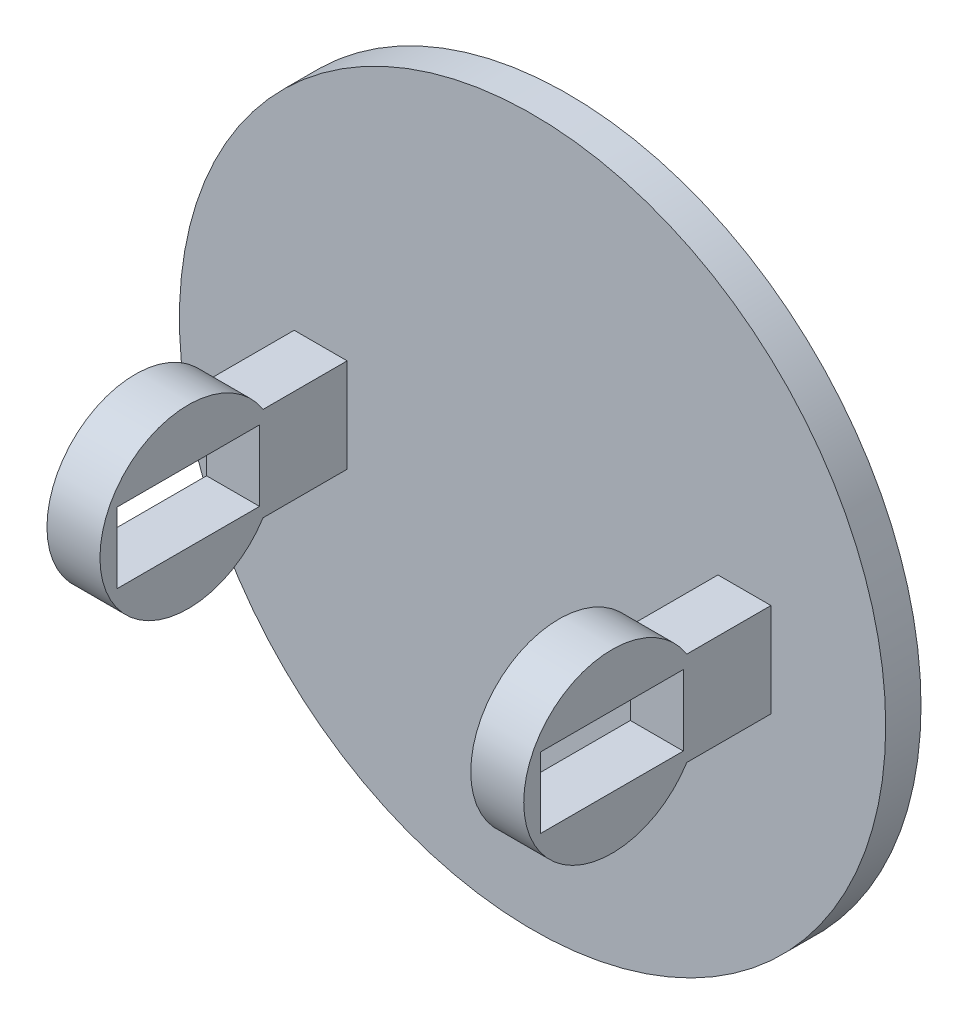
ISO-10303-21;
HEADER;
FILE_DESCRIPTION(('STEP AP214'),'2;1');
FILE_NAME('part.step','',(''),(''),'','','');
FILE_SCHEMA(('AUTOMOTIVE_DESIGN { 1 0 10303 214 1 1 1 1 }'));
ENDSEC;
DATA;
#1=APPLICATION_CONTEXT('core data for automotive mechanical design processes');
#2=APPLICATION_PROTOCOL_DEFINITION('international standard','automotive_design',2000,#1);
#3=PRODUCT_CONTEXT('',#1,'mechanical');
#4=PRODUCT('Part','Part','',(#3));
#5=PRODUCT_RELATED_PRODUCT_CATEGORY('part','',(#4));
#6=PRODUCT_DEFINITION_FORMATION('','',#4);
#7=PRODUCT_DEFINITION_CONTEXT('part definition',#1,'design');
#8=PRODUCT_DEFINITION('design','',#6,#7);
#9=PRODUCT_DEFINITION_SHAPE('','',#8);
#10=(LENGTH_UNIT() NAMED_UNIT(*) SI_UNIT(.MILLI.,.METRE.));
#11=(NAMED_UNIT(*) PLANE_ANGLE_UNIT() SI_UNIT($,.RADIAN.));
#12=(NAMED_UNIT(*) SI_UNIT($,.STERADIAN.) SOLID_ANGLE_UNIT());
#13=UNCERTAINTY_MEASURE_WITH_UNIT(LENGTH_MEASURE(1.E-05),#10,'distance_accuracy_value','');
#14=(GEOMETRIC_REPRESENTATION_CONTEXT(3) GLOBAL_UNCERTAINTY_ASSIGNED_CONTEXT((#13)) GLOBAL_UNIT_ASSIGNED_CONTEXT((#10,
#11,#12)) REPRESENTATION_CONTEXT('',''));
#15=CARTESIAN_POINT('',(0.,0.,0.));
#16=DIRECTION('',(0.,0.,1.));
#17=DIRECTION('',(1.,0.,0.));
#18=AXIS2_PLACEMENT_3D('',#15,#16,#17);
#19=CARTESIAN_POINT('',(-52.5,40.,70.));
#20=DIRECTION('',(-1.,0.,0.));
#21=DIRECTION('',(0.,-1.,0.));
#22=AXIS2_PLACEMENT_3D('',#19,#20,#21);
#23=PLANE('',#22);
#24=DIRECTION('',(0.,0.,-1.));
#25=VECTOR('',#24,1.);
#26=CARTESIAN_POINT('',(-52.5,10.,70.));
#27=LINE('',#26,#25);
#28=CARTESIAN_POINT('',(-52.5,10.,65.190906754257));
#29=VERTEX_POINT('',#28);
#30=CARTESIAN_POINT('',(-52.5,9.99999999999999,24.809093245743));
#31=VERTEX_POINT('',#30);
#32=EDGE_CURVE('E194',#29,#31,#27,.T.);
#33=ORIENTED_EDGE('',*,*,#32,.T.);
#34=DIRECTION('',(0.,-1.,0.));
#35=VECTOR('',#34,1.);
#36=CARTESIAN_POINT('',(-52.5,40.,24.809093245743));
#37=LINE('',#36,#35);
#38=CARTESIAN_POINT('',(-52.5,-10.,24.809093245743));
#39=VERTEX_POINT('',#38);
#40=EDGE_CURVE('E200',#31,#39,#37,.T.);
#41=ORIENTED_EDGE('',*,*,#40,.T.);
#42=DIRECTION('',(0.,0.,1.));
#43=VECTOR('',#42,1.);
#44=CARTESIAN_POINT('',(-52.5,-10.,70.));
#45=LINE('',#44,#43);
#46=CARTESIAN_POINT('',(-52.5,-10.,65.190906754257));
#47=VERTEX_POINT('',#46);
#48=EDGE_CURVE('E187',#39,#47,#45,.T.);
#49=ORIENTED_EDGE('',*,*,#48,.T.);
#50=DIRECTION('',(0.,1.,0.));
#51=VECTOR('',#50,1.);
#52=CARTESIAN_POINT('',(-52.5,40.,65.190906754257));
#53=LINE('',#52,#51);
#54=EDGE_CURVE('E159',#47,#29,#53,.T.);
#55=ORIENTED_EDGE('',*,*,#54,.T.);
#56=EDGE_LOOP('',(#33,#41,#49,#55));
#57=FACE_BOUND('',#56,.T.);
#58=CARTESIAN_POINT('',(-52.5,0.,45.));
#59=DIRECTION('',(-1.,0.,0.));
#60=DIRECTION('',(0.,-1.,0.));
#61=AXIS2_PLACEMENT_3D('',#58,#59,#60);
#62=CIRCLE('',#61,25.);
#63=CARTESIAN_POINT('',(-52.5,-13.2882348052987,23.8240037835466));
#64=VERTEX_POINT('',#63);
#65=CARTESIAN_POINT('',(-52.5,13.2882348052987,23.8240037835466));
#66=VERTEX_POINT('',#65);
#67=EDGE_CURVE('E253',#64,#66,#62,.T.);
#68=ORIENTED_EDGE('',*,*,#67,.F.);
#69=DIRECTION('',(0.,0.,-1.));
#70=VECTOR('',#69,1.);
#71=CARTESIAN_POINT('',(-52.5,-13.2882348052987,70.));
#72=LINE('',#71,#70);
#73=CARTESIAN_POINT('',(-52.5,-13.2882348052987,0.));
#74=VERTEX_POINT('',#73);
#75=EDGE_CURVE('E239',#64,#74,#72,.T.);
#76=ORIENTED_EDGE('',*,*,#75,.T.);
#77=DIRECTION('',(0.,1.,0.));
#78=VECTOR('',#77,1.);
#79=CARTESIAN_POINT('',(-52.5,40.,0.));
#80=LINE('',#79,#78);
#81=CARTESIAN_POINT('',(-52.5,13.2882348052987,0.));
#82=VERTEX_POINT('',#81);
#83=EDGE_CURVE('E259',#74,#82,#80,.T.);
#84=ORIENTED_EDGE('',*,*,#83,.T.);
#85=DIRECTION('',(0.,0.,-1.));
#86=VECTOR('',#85,1.);
#87=CARTESIAN_POINT('',(-52.5,13.2882348052987,70.));
#88=LINE('',#87,#86);
#89=EDGE_CURVE('E256',#66,#82,#88,.T.);
#90=ORIENTED_EDGE('',*,*,#89,.F.);
#91=EDGE_LOOP('',(#68,#76,#84,#90));
#92=FACE_BOUND('',#91,.T.);
#93=ADVANCED_FACE('F41',(#57,#92),#23,.F.);
#94=CARTESIAN_POINT('',(-67.5,40.,70.));
#95=DIRECTION('',(1.,0.,0.));
#96=DIRECTION('',(0.,0.,-1.));
#97=AXIS2_PLACEMENT_3D('',#94,#95,#96);
#98=PLANE('',#97);
#99=DIRECTION('',(0.,0.,1.));
#100=VECTOR('',#99,1.);
#101=CARTESIAN_POINT('',(-67.5,-10.,65.190906754257));
#102=LINE('',#101,#100);
#103=CARTESIAN_POINT('',(-67.5,-10.,24.809093245743));
#104=VERTEX_POINT('',#103);
#105=CARTESIAN_POINT('',(-67.5,-10.,65.190906754257));
#106=VERTEX_POINT('',#105);
#107=EDGE_CURVE('E165',#104,#106,#102,.T.);
#108=ORIENTED_EDGE('',*,*,#107,.F.);
#109=DIRECTION('',(0.,-1.,0.));
#110=VECTOR('',#109,1.);
#111=CARTESIAN_POINT('',(-67.5,9.99999999999999,24.809093245743));
#112=LINE('',#111,#110);
#113=CARTESIAN_POINT('',(-67.5,9.99999999999999,24.809093245743));
#114=VERTEX_POINT('',#113);
#115=EDGE_CURVE('E64',#114,#104,#112,.T.);
#116=ORIENTED_EDGE('',*,*,#115,.F.);
#117=DIRECTION('',(0.,0.,-1.));
#118=VECTOR('',#117,1.);
#119=CARTESIAN_POINT('',(-67.5,10.,65.190906754257));
#120=LINE('',#119,#118);
#121=CARTESIAN_POINT('',(-67.5,10.,65.190906754257));
#122=VERTEX_POINT('',#121);
#123=EDGE_CURVE('E173',#122,#114,#120,.T.);
#124=ORIENTED_EDGE('',*,*,#123,.F.);
#125=DIRECTION('',(0.,1.,0.));
#126=VECTOR('',#125,1.);
#127=CARTESIAN_POINT('',(-67.5,10.,65.190906754257));
#128=LINE('',#127,#126);
#129=EDGE_CURVE('E156',#106,#122,#128,.T.);
#130=ORIENTED_EDGE('',*,*,#129,.F.);
#131=EDGE_LOOP('',(#108,#116,#124,#130));
#132=FACE_BOUND('',#131,.T.);
#133=DIRECTION('',(0.,0.,-1.));
#134=VECTOR('',#133,1.);
#135=CARTESIAN_POINT('',(-67.5,-13.2882348052987,0.));
#136=LINE('',#135,#134);
#137=CARTESIAN_POINT('',(-67.5,-13.2882348052987,23.8240037835466));
#138=VERTEX_POINT('',#137);
#139=CARTESIAN_POINT('',(-67.5,-13.2882348052987,0.));
#140=VERTEX_POINT('',#139);
#141=EDGE_CURVE('E233',#138,#140,#136,.T.);
#142=ORIENTED_EDGE('',*,*,#141,.F.);
#143=CARTESIAN_POINT('',(-67.5,0.,45.));
#144=DIRECTION('',(-1.,0.,0.));
#145=DIRECTION('',(0.,0.,1.));
#146=AXIS2_PLACEMENT_3D('',#143,#144,#145);
#147=CIRCLE('',#146,25.);
#148=CARTESIAN_POINT('',(-67.5,13.2882348052987,23.8240037835466));
#149=VERTEX_POINT('',#148);
#150=EDGE_CURVE('E244',#138,#149,#147,.T.);
#151=ORIENTED_EDGE('',*,*,#150,.T.);
#152=DIRECTION('',(0.,0.,-1.));
#153=VECTOR('',#152,1.);
#154=CARTESIAN_POINT('',(-67.5,13.2882348052987,0.));
#155=LINE('',#154,#153);
#156=CARTESIAN_POINT('',(-67.5,13.2882348052987,0.));
#157=VERTEX_POINT('',#156);
#158=EDGE_CURVE('E247',#149,#157,#155,.T.);
#159=ORIENTED_EDGE('',*,*,#158,.T.);
#160=DIRECTION('',(0.,-1.,0.));
#161=VECTOR('',#160,1.);
#162=CARTESIAN_POINT('',(-67.5,40.,0.));
#163=LINE('',#162,#161);
#164=EDGE_CURVE('E261',#157,#140,#163,.T.);
#165=ORIENTED_EDGE('',*,*,#164,.T.);
#166=EDGE_LOOP('',(#142,#151,#159,#165));
#167=FACE_BOUND('',#166,.T.);
#168=ADVANCED_FACE('F170',(#132,#167),#98,.F.);
#169=CARTESIAN_POINT('',(0.,0.,0.));
#170=DIRECTION('',(0.,0.,1.));
#171=DIRECTION('',(1.,0.,0.));
#172=AXIS2_PLACEMENT_3D('',#169,#170,#171);
#173=PLANE('',#172);
#174=DIRECTION('',(1.,0.,0.));
#175=VECTOR('',#174,1.);
#176=CARTESIAN_POINT('',(27.5,-13.2882348052987,0.));
#177=LINE('',#176,#175);
#178=CARTESIAN_POINT('',(52.5,-13.2882348052987,0.));
#179=VERTEX_POINT('',#178);
#180=CARTESIAN_POINT('',(67.5,-13.2882348052987,0.));
#181=VERTEX_POINT('',#180);
#182=EDGE_CURVE('E206',#179,#181,#177,.T.);
#183=ORIENTED_EDGE('',*,*,#182,.F.);
#184=DIRECTION('',(0.,1.,0.));
#185=VECTOR('',#184,1.);
#186=CARTESIAN_POINT('',(52.5,40.,0.));
#187=LINE('',#186,#185);
#188=CARTESIAN_POINT('',(52.5,13.2882348052987,0.));
#189=VERTEX_POINT('',#188);
#190=EDGE_CURVE('E228',#179,#189,#187,.T.);
#191=ORIENTED_EDGE('',*,*,#190,.T.);
#192=DIRECTION('',(1.,0.,0.));
#193=VECTOR('',#192,1.);
#194=CARTESIAN_POINT('',(27.5,13.2882348052987,0.));
#195=LINE('',#194,#193);
#196=CARTESIAN_POINT('',(67.5,13.2882348052987,0.));
#197=VERTEX_POINT('',#196);
#198=EDGE_CURVE('E221',#189,#197,#195,.T.);
#199=ORIENTED_EDGE('',*,*,#198,.T.);
#200=DIRECTION('',(0.,-1.,0.));
#201=VECTOR('',#200,1.);
#202=CARTESIAN_POINT('',(67.5,40.,0.));
#203=LINE('',#202,#201);
#204=EDGE_CURVE('E230',#197,#181,#203,.T.);
#205=ORIENTED_EDGE('',*,*,#204,.T.);
#206=EDGE_LOOP('',(#183,#191,#199,#205));
#207=FACE_BOUND('',#206,.T.);
#208=ORIENTED_EDGE('',*,*,#83,.F.);
#209=DIRECTION('',(-1.,0.,0.));
#210=VECTOR('',#209,1.);
#211=CARTESIAN_POINT('',(-27.5,-13.2882348052987,0.));
#212=LINE('',#211,#210);
#213=EDGE_CURVE('E237',#74,#140,#212,.T.);
#214=ORIENTED_EDGE('',*,*,#213,.T.);
#215=ORIENTED_EDGE('',*,*,#164,.F.);
#216=DIRECTION('',(-1.,0.,0.));
#217=VECTOR('',#216,1.);
#218=CARTESIAN_POINT('',(-27.5,13.2882348052987,0.));
#219=LINE('',#218,#217);
#220=EDGE_CURVE('E250',#82,#157,#219,.T.);
#221=ORIENTED_EDGE('',*,*,#220,.F.);
#222=EDGE_LOOP('',(#208,#214,#215,#221));
#223=FACE_BOUND('',#222,.T.);
#224=CARTESIAN_POINT('',(0.,0.,0.));
#225=DIRECTION('',(0.,0.,1.));
#226=DIRECTION('',(1.,0.,0.));
#227=AXIS2_PLACEMENT_3D('',#224,#225,#226);
#228=CIRCLE('',#227,100.);
#229=CARTESIAN_POINT('',(100.,0.,0.));
#230=VERTEX_POINT('',#229);
#231=EDGE_CURVE('E267',#230,#230,#228,.T.);
#232=ORIENTED_EDGE('',*,*,#231,.T.);
#233=EDGE_LOOP('',(#232));
#234=FACE_BOUND('',#233,.T.);
#235=ADVANCED_FACE('F320',(#207,#223,#234),#173,.T.);
#236=CARTESIAN_POINT('',(0.,0.,-10.));
#237=DIRECTION('',(0.,0.,1.));
#238=DIRECTION('',(1.,0.,0.));
#239=AXIS2_PLACEMENT_3D('',#236,#237,#238);
#240=CYLINDRICAL_SURFACE('',#239,100.);
#241=CARTESIAN_POINT('',(0.,0.,-10.));
#242=DIRECTION('',(0.,0.,1.));
#243=DIRECTION('',(1.,0.,0.));
#244=AXIS2_PLACEMENT_3D('',#241,#242,#243);
#245=CIRCLE('',#244,100.);
#246=CARTESIAN_POINT('',(100.,0.,-10.));
#247=VERTEX_POINT('',#246);
#248=EDGE_CURVE('E272',#247,#247,#245,.T.);
#249=ORIENTED_EDGE('',*,*,#248,.T.);
#250=EDGE_LOOP('',(#249));
#251=FACE_BOUND('',#250,.T.);
#252=ORIENTED_EDGE('',*,*,#231,.F.);
#253=EDGE_LOOP('',(#252));
#254=FACE_BOUND('',#253,.T.);
#255=ADVANCED_FACE('F43',(#251,#254),#240,.T.);
#256=CARTESIAN_POINT('',(0.,0.,-10.));
#257=DIRECTION('',(0.,0.,1.));
#258=DIRECTION('',(1.,0.,0.));
#259=AXIS2_PLACEMENT_3D('',#256,#257,#258);
#260=PLANE('',#259);
#261=CARTESIAN_POINT('',(0.,0.,-10.));
#262=DIRECTION('',(0.,0.,-1.));
#263=DIRECTION('',(-1.,0.,0.));
#264=AXIS2_PLACEMENT_3D('',#261,#262,#263);
#265=CIRCLE('',#264,25.);
#266=CARTESIAN_POINT('',(-25.,0.,-10.));
#267=VERTEX_POINT('',#266);
#268=EDGE_CURVE('E268',#267,#267,#265,.T.);
#269=ORIENTED_EDGE('',*,*,#268,.F.);
#270=EDGE_LOOP('',(#269));
#271=FACE_BOUND('',#270,.T.);
#272=ORIENTED_EDGE('',*,*,#248,.F.);
#273=EDGE_LOOP('',(#272));
#274=FACE_BOUND('',#273,.T.);
#275=ADVANCED_FACE('F356',(#271,#274),#260,.F.);
#276=CARTESIAN_POINT('',(0.,0.,-35.));
#277=DIRECTION('',(0.,0.,1.));
#278=DIRECTION('',(1.,0.,0.));
#279=AXIS2_PLACEMENT_3D('',#276,#277,#278);
#280=CYLINDRICAL_SURFACE('',#279,25.);
#281=CARTESIAN_POINT('',(0.,0.,-35.));
#282=DIRECTION('',(0.,0.,-1.));
#283=DIRECTION('',(-1.,0.,0.));
#284=AXIS2_PLACEMENT_3D('',#281,#282,#283);
#285=CIRCLE('',#284,25.);
#286=CARTESIAN_POINT('',(-25.,0.,-35.));
#287=VERTEX_POINT('',#286);
#288=EDGE_CURVE('E264',#287,#287,#285,.T.);
#289=ORIENTED_EDGE('',*,*,#288,.F.);
#290=EDGE_LOOP('',(#289));
#291=FACE_BOUND('',#290,.T.);
#292=ORIENTED_EDGE('',*,*,#268,.T.);
#293=EDGE_LOOP('',(#292));
#294=FACE_BOUND('',#293,.T.);
#295=ADVANCED_FACE('F352',(#291,#294),#280,.T.);
#296=CARTESIAN_POINT('',(0.,0.,-35.));
#297=DIRECTION('',(0.,0.,-1.));
#298=DIRECTION('',(-1.,0.,0.));
#299=AXIS2_PLACEMENT_3D('',#296,#297,#298);
#300=PLANE('',#299);
#301=ORIENTED_EDGE('',*,*,#288,.T.);
#302=EDGE_LOOP('',(#301));
#303=FACE_BOUND('',#302,.T.);
#304=ADVANCED_FACE('F348',(#303),#300,.T.);
#305=CARTESIAN_POINT('',(-27.5,13.2882348052987,0.));
#306=DIRECTION('',(0.,1.,0.));
#307=DIRECTION('',(0.,0.,1.));
#308=AXIS2_PLACEMENT_3D('',#305,#306,#307);
#309=PLANE('',#308);
#310=ORIENTED_EDGE('',*,*,#89,.T.);
#311=ORIENTED_EDGE('',*,*,#220,.T.);
#312=ORIENTED_EDGE('',*,*,#158,.F.);
#313=DIRECTION('',(-1.,0.,0.));
#314=VECTOR('',#313,1.);
#315=CARTESIAN_POINT('',(-27.5,13.2882348052987,23.8240037835466));
#316=LINE('',#315,#314);
#317=EDGE_CURVE('E251',#66,#149,#316,.T.);
#318=ORIENTED_EDGE('',*,*,#317,.F.);
#319=EDGE_LOOP('',(#310,#311,#312,#318));
#320=FACE_BOUND('',#319,.T.);
#321=ADVANCED_FACE('F351',(#320),#309,.T.);
#322=CARTESIAN_POINT('',(-27.5,0.,45.));
#323=DIRECTION('',(-1.,0.,0.));
#324=DIRECTION('',(0.,0.,1.));
#325=AXIS2_PLACEMENT_3D('',#322,#323,#324);
#326=CYLINDRICAL_SURFACE('',#325,25.);
#327=ORIENTED_EDGE('',*,*,#67,.T.);
#328=ORIENTED_EDGE('',*,*,#317,.T.);
#329=ORIENTED_EDGE('',*,*,#150,.F.);
#330=DIRECTION('',(-1.,0.,0.));
#331=VECTOR('',#330,1.);
#332=CARTESIAN_POINT('',(-27.5,-13.2882348052987,23.8240037835466));
#333=LINE('',#332,#331);
#334=EDGE_CURVE('E236',#64,#138,#333,.T.);
#335=ORIENTED_EDGE('',*,*,#334,.F.);
#336=EDGE_LOOP('',(#327,#328,#329,#335));
#337=FACE_BOUND('',#336,.T.);
#338=ADVANCED_FACE('F392',(#337),#326,.T.);
#339=CARTESIAN_POINT('',(-27.5,-13.2882348052987,0.));
#340=DIRECTION('',(0.,1.,0.));
#341=DIRECTION('',(0.,0.,1.));
#342=AXIS2_PLACEMENT_3D('',#339,#340,#341);
#343=PLANE('',#342);
#344=ORIENTED_EDGE('',*,*,#334,.T.);
#345=ORIENTED_EDGE('',*,*,#141,.T.);
#346=ORIENTED_EDGE('',*,*,#213,.F.);
#347=ORIENTED_EDGE('',*,*,#75,.F.);
#348=EDGE_LOOP('',(#344,#345,#346,#347));
#349=FACE_BOUND('',#348,.T.);
#350=ADVANCED_FACE('F309',(#349),#343,.F.);
#351=CARTESIAN_POINT('',(52.5,40.,70.));
#352=DIRECTION('',(-1.,0.,0.));
#353=DIRECTION('',(0.,-1.,0.));
#354=AXIS2_PLACEMENT_3D('',#351,#352,#353);
#355=PLANE('',#354);
#356=DIRECTION('',(0.,-1.,0.));
#357=VECTOR('',#356,1.);
#358=CARTESIAN_POINT('',(52.5,40.,24.809093245743));
#359=LINE('',#358,#357);
#360=CARTESIAN_POINT('',(52.5,9.99999999999999,24.809093245743));
#361=VERTEX_POINT('',#360);
#362=CARTESIAN_POINT('',(52.5,-10.,24.809093245743));
#363=VERTEX_POINT('',#362);
#364=EDGE_CURVE('E197',#361,#363,#359,.T.);
#365=ORIENTED_EDGE('',*,*,#364,.F.);
#366=DIRECTION('',(0.,0.,-1.));
#367=VECTOR('',#366,1.);
#368=CARTESIAN_POINT('',(52.5,10.,70.));
#369=LINE('',#368,#367);
#370=CARTESIAN_POINT('',(52.5,10.,65.190906754257));
#371=VERTEX_POINT('',#370);
#372=EDGE_CURVE('E192',#371,#361,#369,.T.);
#373=ORIENTED_EDGE('',*,*,#372,.F.);
#374=DIRECTION('',(0.,1.,0.));
#375=VECTOR('',#374,1.);
#376=CARTESIAN_POINT('',(52.5,40.,65.190906754257));
#377=LINE('',#376,#375);
#378=CARTESIAN_POINT('',(52.5,-10.,65.190906754257));
#379=VERTEX_POINT('',#378);
#380=EDGE_CURVE('E189',#379,#371,#377,.T.);
#381=ORIENTED_EDGE('',*,*,#380,.F.);
#382=DIRECTION('',(0.,0.,1.));
#383=VECTOR('',#382,1.);
#384=CARTESIAN_POINT('',(52.5,-10.,70.));
#385=LINE('',#384,#383);
#386=EDGE_CURVE('E185',#363,#379,#385,.T.);
#387=ORIENTED_EDGE('',*,*,#386,.F.);
#388=EDGE_LOOP('',(#365,#373,#381,#387));
#389=FACE_BOUND('',#388,.T.);
#390=DIRECTION('',(0.,0.,1.));
#391=VECTOR('',#390,1.);
#392=CARTESIAN_POINT('',(52.5,-13.2882348052987,70.));
#393=LINE('',#392,#391);
#394=CARTESIAN_POINT('',(52.5,-13.2882348052987,23.8240037835466));
#395=VERTEX_POINT('',#394);
#396=EDGE_CURVE('E210',#179,#395,#393,.T.);
#397=ORIENTED_EDGE('',*,*,#396,.T.);
#398=CARTESIAN_POINT('',(52.5,0.,45.));
#399=DIRECTION('',(-1.,0.,0.));
#400=DIRECTION('',(0.,-1.,0.));
#401=AXIS2_PLACEMENT_3D('',#398,#399,#400);
#402=CIRCLE('',#401,25.);
#403=CARTESIAN_POINT('',(52.5,13.2882348052987,23.8240037835466));
#404=VERTEX_POINT('',#403);
#405=EDGE_CURVE('E223',#404,#395,#402,.F.);
#406=ORIENTED_EDGE('',*,*,#405,.F.);
#407=DIRECTION('',(0.,0.,1.));
#408=VECTOR('',#407,1.);
#409=CARTESIAN_POINT('',(52.5,13.2882348052987,70.));
#410=LINE('',#409,#408);
#411=EDGE_CURVE('E226',#189,#404,#410,.T.);
#412=ORIENTED_EDGE('',*,*,#411,.F.);
#413=ORIENTED_EDGE('',*,*,#190,.F.);
#414=EDGE_LOOP('',(#397,#406,#412,#413));
#415=FACE_BOUND('',#414,.T.);
#416=ADVANCED_FACE('F306',(#389,#415),#355,.T.);
#417=CARTESIAN_POINT('',(67.5,40.,70.));
#418=DIRECTION('',(1.,0.,0.));
#419=DIRECTION('',(0.,0.,-1.));
#420=AXIS2_PLACEMENT_3D('',#417,#418,#419);
#421=PLANE('',#420);
#422=DIRECTION('',(0.,1.,0.));
#423=VECTOR('',#422,1.);
#424=CARTESIAN_POINT('',(67.5,40.,24.809093245743));
#425=LINE('',#424,#423);
#426=CARTESIAN_POINT('',(67.5,-10.,24.809093245743));
#427=VERTEX_POINT('',#426);
#428=CARTESIAN_POINT('',(67.5,9.99999999999999,24.809093245743));
#429=VERTEX_POINT('',#428);
#430=EDGE_CURVE('E11',#427,#429,#425,.T.);
#431=ORIENTED_EDGE('',*,*,#430,.F.);
#432=DIRECTION('',(0.,0.,-1.));
#433=VECTOR('',#432,1.);
#434=CARTESIAN_POINT('',(67.5,-10.,70.));
#435=LINE('',#434,#433);
#436=CARTESIAN_POINT('',(67.5,-10.,65.190906754257));
#437=VERTEX_POINT('',#436);
#438=EDGE_CURVE('E271',#437,#427,#435,.T.);
#439=ORIENTED_EDGE('',*,*,#438,.F.);
#440=DIRECTION('',(0.,-1.,0.));
#441=VECTOR('',#440,1.);
#442=CARTESIAN_POINT('',(67.5,40.,65.190906754257));
#443=LINE('',#442,#441);
#444=CARTESIAN_POINT('',(67.5,10.,65.190906754257));
#445=VERTEX_POINT('',#444);
#446=EDGE_CURVE('E278',#445,#437,#443,.T.);
#447=ORIENTED_EDGE('',*,*,#446,.F.);
#448=DIRECTION('',(0.,0.,1.));
#449=VECTOR('',#448,1.);
#450=CARTESIAN_POINT('',(67.5,10.,70.));
#451=LINE('',#450,#449);
#452=EDGE_CURVE('E49',#429,#445,#451,.T.);
#453=ORIENTED_EDGE('',*,*,#452,.F.);
#454=EDGE_LOOP('',(#431,#439,#447,#453));
#455=FACE_BOUND('',#454,.T.);
#456=CARTESIAN_POINT('',(67.5,0.,45.));
#457=DIRECTION('',(-1.,0.,0.));
#458=DIRECTION('',(0.,0.,1.));
#459=AXIS2_PLACEMENT_3D('',#456,#457,#458);
#460=CIRCLE('',#459,25.);
#461=CARTESIAN_POINT('',(67.5,-13.2882348052987,23.8240037835466));
#462=VERTEX_POINT('',#461);
#463=CARTESIAN_POINT('',(67.5,13.2882348052987,23.8240037835466));
#464=VERTEX_POINT('',#463);
#465=EDGE_CURVE('E214',#462,#464,#460,.T.);
#466=ORIENTED_EDGE('',*,*,#465,.F.);
#467=DIRECTION('',(0.,0.,-1.));
#468=VECTOR('',#467,1.);
#469=CARTESIAN_POINT('',(67.5,-13.2882348052987,0.));
#470=LINE('',#469,#468);
#471=EDGE_CURVE('E203',#462,#181,#470,.T.);
#472=ORIENTED_EDGE('',*,*,#471,.T.);
#473=ORIENTED_EDGE('',*,*,#204,.F.);
#474=DIRECTION('',(0.,0.,-1.));
#475=VECTOR('',#474,1.);
#476=CARTESIAN_POINT('',(67.5,13.2882348052987,0.));
#477=LINE('',#476,#475);
#478=EDGE_CURVE('E217',#464,#197,#477,.T.);
#479=ORIENTED_EDGE('',*,*,#478,.F.);
#480=EDGE_LOOP('',(#466,#472,#473,#479));
#481=FACE_BOUND('',#480,.T.);
#482=ADVANCED_FACE('F296',(#455,#481),#421,.T.);
#483=CARTESIAN_POINT('',(27.5,0.,45.));
#484=DIRECTION('',(1.,0.,0.));
#485=DIRECTION('',(0.,0.,-1.));
#486=AXIS2_PLACEMENT_3D('',#483,#484,#485);
#487=CYLINDRICAL_SURFACE('',#486,25.);
#488=ORIENTED_EDGE('',*,*,#405,.T.);
#489=DIRECTION('',(1.,0.,0.));
#490=VECTOR('',#489,1.);
#491=CARTESIAN_POINT('',(27.5,-13.2882348052987,23.8240037835466));
#492=LINE('',#491,#490);
#493=EDGE_CURVE('E207',#395,#462,#492,.T.);
#494=ORIENTED_EDGE('',*,*,#493,.T.);
#495=ORIENTED_EDGE('',*,*,#465,.T.);
#496=DIRECTION('',(1.,0.,0.));
#497=VECTOR('',#496,1.);
#498=CARTESIAN_POINT('',(27.5,13.2882348052987,23.8240037835466));
#499=LINE('',#498,#497);
#500=EDGE_CURVE('E220',#404,#464,#499,.T.);
#501=ORIENTED_EDGE('',*,*,#500,.F.);
#502=EDGE_LOOP('',(#488,#494,#495,#501));
#503=FACE_BOUND('',#502,.T.);
#504=ADVANCED_FACE('F327',(#503),#487,.T.);
#505=CARTESIAN_POINT('',(27.5,13.2882348052987,0.));
#506=DIRECTION('',(0.,-1.,0.));
#507=DIRECTION('',(0.,0.,-1.));
#508=AXIS2_PLACEMENT_3D('',#505,#506,#507);
#509=PLANE('',#508);
#510=ORIENTED_EDGE('',*,*,#411,.T.);
#511=ORIENTED_EDGE('',*,*,#500,.T.);
#512=ORIENTED_EDGE('',*,*,#478,.T.);
#513=ORIENTED_EDGE('',*,*,#198,.F.);
#514=EDGE_LOOP('',(#510,#511,#512,#513));
#515=FACE_BOUND('',#514,.T.);
#516=ADVANCED_FACE('F329',(#515),#509,.F.);
#517=CARTESIAN_POINT('',(27.5,-13.2882348052987,0.));
#518=DIRECTION('',(0.,-1.,0.));
#519=DIRECTION('',(0.,0.,-1.));
#520=AXIS2_PLACEMENT_3D('',#517,#518,#519);
#521=PLANE('',#520);
#522=ORIENTED_EDGE('',*,*,#182,.T.);
#523=ORIENTED_EDGE('',*,*,#471,.F.);
#524=ORIENTED_EDGE('',*,*,#493,.F.);
#525=ORIENTED_EDGE('',*,*,#396,.F.);
#526=EDGE_LOOP('',(#522,#523,#524,#525));
#527=FACE_BOUND('',#526,.T.);
#528=ADVANCED_FACE('F317',(#527),#521,.T.);
#529=CARTESIAN_POINT('',(100.,-10.,65.190906754257));
#530=DIRECTION('',(0.,-1.,0.));
#531=DIRECTION('',(0.,0.,-1.));
#532=AXIS2_PLACEMENT_3D('',#529,#530,#531);
#533=PLANE('',#532);
#534=ORIENTED_EDGE('',*,*,#386,.T.);
#535=DIRECTION('',(-1.,0.,0.));
#536=VECTOR('',#535,1.);
#537=CARTESIAN_POINT('',(100.,-10.,65.190906754257));
#538=LINE('',#537,#536);
#539=EDGE_CURVE('E161',#437,#379,#538,.T.);
#540=ORIENTED_EDGE('',*,*,#539,.F.);
#541=ORIENTED_EDGE('',*,*,#438,.T.);
#542=DIRECTION('',(-1.,0.,0.));
#543=VECTOR('',#542,1.);
#544=CARTESIAN_POINT('',(100.,-10.,24.809093245743));
#545=LINE('',#544,#543);
#546=EDGE_CURVE('E162',#427,#363,#545,.T.);
#547=ORIENTED_EDGE('',*,*,#546,.T.);
#548=EDGE_LOOP('',(#534,#540,#541,#547));
#549=FACE_BOUND('',#548,.T.);
#550=ADVANCED_FACE('F300',(#549),#533,.F.);
#551=CARTESIAN_POINT('',(100.,10.,65.190906754257));
#552=DIRECTION('',(0.,0.,1.));
#553=DIRECTION('',(1.,0.,0.));
#554=AXIS2_PLACEMENT_3D('',#551,#552,#553);
#555=PLANE('',#554);
#556=ORIENTED_EDGE('',*,*,#380,.T.);
#557=DIRECTION('',(-1.,0.,0.));
#558=VECTOR('',#557,1.);
#559=CARTESIAN_POINT('',(100.,10.,65.190906754257));
#560=LINE('',#559,#558);
#561=EDGE_CURVE('E181',#445,#371,#560,.T.);
#562=ORIENTED_EDGE('',*,*,#561,.F.);
#563=ORIENTED_EDGE('',*,*,#446,.T.);
#564=ORIENTED_EDGE('',*,*,#539,.T.);
#565=EDGE_LOOP('',(#556,#562,#563,#564));
#566=FACE_BOUND('',#565,.T.);
#567=ADVANCED_FACE('F292',(#566),#555,.F.);
#568=CARTESIAN_POINT('',(100.,10.,65.190906754257));
#569=DIRECTION('',(0.,1.,0.));
#570=DIRECTION('',(0.,0.,1.));
#571=AXIS2_PLACEMENT_3D('',#568,#569,#570);
#572=PLANE('',#571);
#573=ORIENTED_EDGE('',*,*,#372,.T.);
#574=DIRECTION('',(-1.,0.,0.));
#575=VECTOR('',#574,1.);
#576=CARTESIAN_POINT('',(100.,9.99999999999999,24.809093245743));
#577=LINE('',#576,#575);
#578=EDGE_CURVE('E180',#429,#361,#577,.T.);
#579=ORIENTED_EDGE('',*,*,#578,.F.);
#580=ORIENTED_EDGE('',*,*,#452,.T.);
#581=ORIENTED_EDGE('',*,*,#561,.T.);
#582=EDGE_LOOP('',(#573,#579,#580,#581));
#583=FACE_BOUND('',#582,.T.);
#584=ADVANCED_FACE('F285',(#583),#572,.F.);
#585=CARTESIAN_POINT('',(100.,9.99999999999999,24.809093245743));
#586=DIRECTION('',(0.,0.,-1.));
#587=DIRECTION('',(-1.,0.,0.));
#588=AXIS2_PLACEMENT_3D('',#585,#586,#587);
#589=PLANE('',#588);
#590=ORIENTED_EDGE('',*,*,#364,.T.);
#591=ORIENTED_EDGE('',*,*,#546,.F.);
#592=ORIENTED_EDGE('',*,*,#430,.T.);
#593=ORIENTED_EDGE('',*,*,#578,.T.);
#594=EDGE_LOOP('',(#590,#591,#592,#593));
#595=FACE_BOUND('',#594,.T.);
#596=ADVANCED_FACE('F302',(#595),#589,.F.);
#597=EDGE_CURVE('E178',#31,#114,#577,.T.);
#598=ORIENTED_EDGE('',*,*,#597,.T.);
#599=ORIENTED_EDGE('',*,*,#115,.T.);
#600=EDGE_CURVE('E167',#39,#104,#545,.T.);
#601=ORIENTED_EDGE('',*,*,#600,.F.);
#602=ORIENTED_EDGE('',*,*,#40,.F.);
#603=EDGE_LOOP('',(#598,#599,#601,#602));
#604=FACE_BOUND('',#603,.T.);
#605=ADVANCED_FACE('F462',(#604),#589,.F.);
#606=EDGE_CURVE('E182',#29,#122,#560,.T.);
#607=ORIENTED_EDGE('',*,*,#606,.T.);
#608=ORIENTED_EDGE('',*,*,#123,.T.);
#609=ORIENTED_EDGE('',*,*,#597,.F.);
#610=ORIENTED_EDGE('',*,*,#32,.F.);
#611=EDGE_LOOP('',(#607,#608,#609,#610));
#612=FACE_BOUND('',#611,.T.);
#613=ADVANCED_FACE('F456',(#612),#572,.F.);
#614=EDGE_CURVE('E56',#47,#106,#538,.T.);
#615=ORIENTED_EDGE('',*,*,#614,.T.);
#616=ORIENTED_EDGE('',*,*,#129,.T.);
#617=ORIENTED_EDGE('',*,*,#606,.F.);
#618=ORIENTED_EDGE('',*,*,#54,.F.);
#619=EDGE_LOOP('',(#615,#616,#617,#618));
#620=FACE_BOUND('',#619,.T.);
#621=ADVANCED_FACE('F153',(#620),#555,.F.);
#622=ORIENTED_EDGE('',*,*,#600,.T.);
#623=ORIENTED_EDGE('',*,*,#107,.T.);
#624=ORIENTED_EDGE('',*,*,#614,.F.);
#625=ORIENTED_EDGE('',*,*,#48,.F.);
#626=EDGE_LOOP('',(#622,#623,#624,#625));
#627=FACE_BOUND('',#626,.T.);
#628=ADVANCED_FACE('F166',(#627),#533,.F.);
#629=CLOSED_SHELL('',(#93,#168,#235,#255,#275,#295,#304,#321,#338,#350,#416,#482,#504,#516,#528,
#550,#567,#584,#596,#605,#613,#621,#628));
#630=MANIFOLD_SOLID_BREP('B2',#629);
#631=ADVANCED_BREP_SHAPE_REPRESENTATION('',(#18,#630),#14);
#632=SHAPE_DEFINITION_REPRESENTATION(#9,#631);
ENDSEC;
END-ISO-10303-21;
